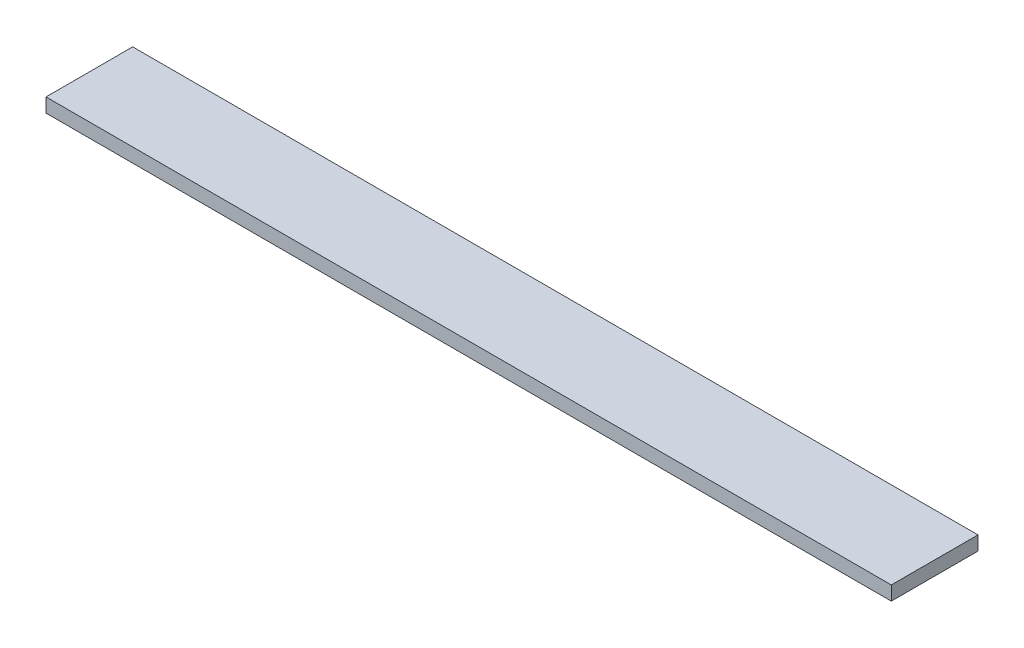
ISO-10303-21;
HEADER;
FILE_DESCRIPTION(('STEP AP214'),'2;1');
FILE_NAME('part.step','',(''),(''),'','','');
FILE_SCHEMA(('AUTOMOTIVE_DESIGN { 1 0 10303 214 1 1 1 1 }'));
ENDSEC;
DATA;
#1=APPLICATION_CONTEXT('core data for automotive mechanical design processes');
#2=APPLICATION_PROTOCOL_DEFINITION('international standard','automotive_design',2000,#1);
#3=PRODUCT_CONTEXT('',#1,'mechanical');
#4=PRODUCT('Part','Part','',(#3));
#5=PRODUCT_RELATED_PRODUCT_CATEGORY('part','',(#4));
#6=PRODUCT_DEFINITION_FORMATION('','',#4);
#7=PRODUCT_DEFINITION_CONTEXT('part definition',#1,'design');
#8=PRODUCT_DEFINITION('design','',#6,#7);
#9=PRODUCT_DEFINITION_SHAPE('','',#8);
#10=(LENGTH_UNIT() NAMED_UNIT(*) SI_UNIT(.MILLI.,.METRE.));
#11=(NAMED_UNIT(*) PLANE_ANGLE_UNIT() SI_UNIT($,.RADIAN.));
#12=(NAMED_UNIT(*) SI_UNIT($,.STERADIAN.) SOLID_ANGLE_UNIT());
#13=UNCERTAINTY_MEASURE_WITH_UNIT(LENGTH_MEASURE(1.E-05),#10,'distance_accuracy_value','');
#14=(GEOMETRIC_REPRESENTATION_CONTEXT(3) GLOBAL_UNCERTAINTY_ASSIGNED_CONTEXT((#13)) GLOBAL_UNIT_ASSIGNED_CONTEXT((#10,
#11,#12)) REPRESENTATION_CONTEXT('',''));
#15=CARTESIAN_POINT('',(0.,0.,0.));
#16=DIRECTION('',(0.,0.,1.));
#17=DIRECTION('',(1.,0.,0.));
#18=AXIS2_PLACEMENT_3D('',#15,#16,#17);
#19=CARTESIAN_POINT('',(-654.366297348485,21.59,-238.622296401515));
#20=DIRECTION('',(1.,0.,0.));
#21=DIRECTION('',(0.,0.,-1.));
#22=AXIS2_PLACEMENT_3D('',#19,#20,#21);
#23=PLANE('',#22);
#24=DIRECTION('',(0.,0.,1.));
#25=VECTOR('',#24,1.);
#26=CARTESIAN_POINT('',(-654.366297348485,0.,-238.622296401515));
#27=LINE('',#26,#25);
#28=CARTESIAN_POINT('',(-654.366297348485,0.,-238.622296401515));
#29=VERTEX_POINT('',#28);
#30=CARTESIAN_POINT('',(-654.366297348485,0.,-105.272296401514));
#31=VERTEX_POINT('',#30);
#32=EDGE_CURVE('E95',#29,#31,#27,.T.);
#33=ORIENTED_EDGE('',*,*,#32,.T.);
#34=DIRECTION('',(0.,-1.,0.));
#35=VECTOR('',#34,1.);
#36=CARTESIAN_POINT('',(-654.366297348485,21.59,-105.272296401514));
#37=LINE('',#36,#35);
#38=CARTESIAN_POINT('',(-654.366297348485,21.59,-105.272296401514));
#39=VERTEX_POINT('',#38);
#40=EDGE_CURVE('E11',#39,#31,#37,.T.);
#41=ORIENTED_EDGE('',*,*,#40,.F.);
#42=DIRECTION('',(0.,0.,1.));
#43=VECTOR('',#42,1.);
#44=CARTESIAN_POINT('',(-654.366297348485,21.59,-238.622296401515));
#45=LINE('',#44,#43);
#46=CARTESIAN_POINT('',(-654.366297348485,21.59,-238.622296401515));
#47=VERTEX_POINT('',#46);
#48=EDGE_CURVE('E83',#47,#39,#45,.T.);
#49=ORIENTED_EDGE('',*,*,#48,.F.);
#50=DIRECTION('',(0.,-1.,0.));
#51=VECTOR('',#50,1.);
#52=CARTESIAN_POINT('',(-654.366297348485,21.59,-238.622296401515));
#53=LINE('',#52,#51);
#54=EDGE_CURVE('E91',#47,#29,#53,.T.);
#55=ORIENTED_EDGE('',*,*,#54,.T.);
#56=EDGE_LOOP('',(#33,#41,#49,#55));
#57=FACE_BOUND('',#56,.T.);
#58=ADVANCED_FACE('F32',(#57),#23,.F.);
#59=CARTESIAN_POINT('',(-654.366297348485,21.59,-105.272296401514));
#60=DIRECTION('',(0.,0.,-1.));
#61=DIRECTION('',(-1.,0.,0.));
#62=AXIS2_PLACEMENT_3D('',#59,#60,#61);
#63=PLANE('',#62);
#64=DIRECTION('',(1.,0.,0.));
#65=VECTOR('',#64,1.);
#66=CARTESIAN_POINT('',(-654.366297348485,0.,-105.272296401514));
#67=LINE('',#66,#65);
#68=CARTESIAN_POINT('',(645.796202651515,0.,-105.272296401514));
#69=VERTEX_POINT('',#68);
#70=EDGE_CURVE('E87',#31,#69,#67,.T.);
#71=ORIENTED_EDGE('',*,*,#70,.T.);
#72=DIRECTION('',(0.,-1.,0.));
#73=VECTOR('',#72,1.);
#74=CARTESIAN_POINT('',(645.796202651515,21.59,-105.272296401514));
#75=LINE('',#74,#73);
#76=CARTESIAN_POINT('',(645.796202651515,21.59,-105.272296401514));
#77=VERTEX_POINT('',#76);
#78=EDGE_CURVE('E40',#77,#69,#75,.T.);
#79=ORIENTED_EDGE('',*,*,#78,.F.);
#80=DIRECTION('',(1.,0.,0.));
#81=VECTOR('',#80,1.);
#82=CARTESIAN_POINT('',(-654.366297348485,21.59,-105.272296401514));
#83=LINE('',#82,#81);
#84=EDGE_CURVE('E78',#39,#77,#83,.T.);
#85=ORIENTED_EDGE('',*,*,#84,.F.);
#86=ORIENTED_EDGE('',*,*,#40,.T.);
#87=EDGE_LOOP('',(#71,#79,#85,#86));
#88=FACE_BOUND('',#87,.T.);
#89=ADVANCED_FACE('F86',(#88),#63,.F.);
#90=CARTESIAN_POINT('',(645.796202651515,21.59,-238.622296401515));
#91=DIRECTION('',(-1.,0.,0.));
#92=DIRECTION('',(0.,0.,1.));
#93=AXIS2_PLACEMENT_3D('',#90,#91,#92);
#94=PLANE('',#93);
#95=DIRECTION('',(0.,0.,-1.));
#96=VECTOR('',#95,1.);
#97=CARTESIAN_POINT('',(645.796202651515,0.,-238.622296401515));
#98=LINE('',#97,#96);
#99=CARTESIAN_POINT('',(645.796202651515,0.,-238.622296401515));
#100=VERTEX_POINT('',#99);
#101=EDGE_CURVE('E65',#69,#100,#98,.T.);
#102=ORIENTED_EDGE('',*,*,#101,.T.);
#103=DIRECTION('',(0.,-1.,0.));
#104=VECTOR('',#103,1.);
#105=CARTESIAN_POINT('',(645.796202651515,21.59,-238.622296401515));
#106=LINE('',#105,#104);
#107=CARTESIAN_POINT('',(645.796202651515,21.59,-238.622296401515));
#108=VERTEX_POINT('',#107);
#109=EDGE_CURVE('E88',#108,#100,#106,.T.);
#110=ORIENTED_EDGE('',*,*,#109,.F.);
#111=DIRECTION('',(0.,0.,-1.));
#112=VECTOR('',#111,1.);
#113=CARTESIAN_POINT('',(645.796202651515,21.59,-238.622296401515));
#114=LINE('',#113,#112);
#115=EDGE_CURVE('E81',#77,#108,#114,.T.);
#116=ORIENTED_EDGE('',*,*,#115,.F.);
#117=ORIENTED_EDGE('',*,*,#78,.T.);
#118=EDGE_LOOP('',(#102,#110,#116,#117));
#119=FACE_BOUND('',#118,.T.);
#120=ADVANCED_FACE('F89',(#119),#94,.F.);
#121=CARTESIAN_POINT('',(-654.366297348485,21.59,-238.622296401515));
#122=DIRECTION('',(0.,0.,1.));
#123=DIRECTION('',(1.,0.,0.));
#124=AXIS2_PLACEMENT_3D('',#121,#122,#123);
#125=PLANE('',#124);
#126=DIRECTION('',(-1.,0.,0.));
#127=VECTOR('',#126,1.);
#128=CARTESIAN_POINT('',(-654.366297348485,0.,-238.622296401515));
#129=LINE('',#128,#127);
#130=EDGE_CURVE('E71',#100,#29,#129,.T.);
#131=ORIENTED_EDGE('',*,*,#130,.T.);
#132=ORIENTED_EDGE('',*,*,#54,.F.);
#133=DIRECTION('',(-1.,0.,0.));
#134=VECTOR('',#133,1.);
#135=CARTESIAN_POINT('',(-654.366297348485,21.59,-238.622296401515));
#136=LINE('',#135,#134);
#137=EDGE_CURVE('E48',#108,#47,#136,.T.);
#138=ORIENTED_EDGE('',*,*,#137,.F.);
#139=ORIENTED_EDGE('',*,*,#109,.T.);
#140=EDGE_LOOP('',(#131,#132,#138,#139));
#141=FACE_BOUND('',#140,.T.);
#142=ADVANCED_FACE('F102',(#141),#125,.F.);
#143=CARTESIAN_POINT('',(0.,21.59,0.));
#144=DIRECTION('',(0.,1.,0.));
#145=DIRECTION('',(0.,0.,1.));
#146=AXIS2_PLACEMENT_3D('',#143,#144,#145);
#147=PLANE('',#146);
#148=ORIENTED_EDGE('',*,*,#48,.T.);
#149=ORIENTED_EDGE('',*,*,#84,.T.);
#150=ORIENTED_EDGE('',*,*,#115,.T.);
#151=ORIENTED_EDGE('',*,*,#137,.T.);
#152=EDGE_LOOP('',(#148,#149,#150,#151));
#153=FACE_BOUND('',#152,.T.);
#154=ADVANCED_FACE('F79',(#153),#147,.T.);
#155=CARTESIAN_POINT('',(0.,0.,0.));
#156=DIRECTION('',(0.,1.,0.));
#157=DIRECTION('',(0.,0.,1.));
#158=AXIS2_PLACEMENT_3D('',#155,#156,#157);
#159=PLANE('',#158);
#160=ORIENTED_EDGE('',*,*,#32,.F.);
#161=ORIENTED_EDGE('',*,*,#130,.F.);
#162=ORIENTED_EDGE('',*,*,#101,.F.);
#163=ORIENTED_EDGE('',*,*,#70,.F.);
#164=EDGE_LOOP('',(#160,#161,#162,#163));
#165=FACE_BOUND('',#164,.T.);
#166=ADVANCED_FACE('F105',(#165),#159,.F.);
#167=CLOSED_SHELL('',(#58,#89,#120,#142,#154,#166));
#168=MANIFOLD_SOLID_BREP('B2',#167);
#169=ADVANCED_BREP_SHAPE_REPRESENTATION('',(#18,#168),#14);
#170=SHAPE_DEFINITION_REPRESENTATION(#9,#169);
ENDSEC;
END-ISO-10303-21;
